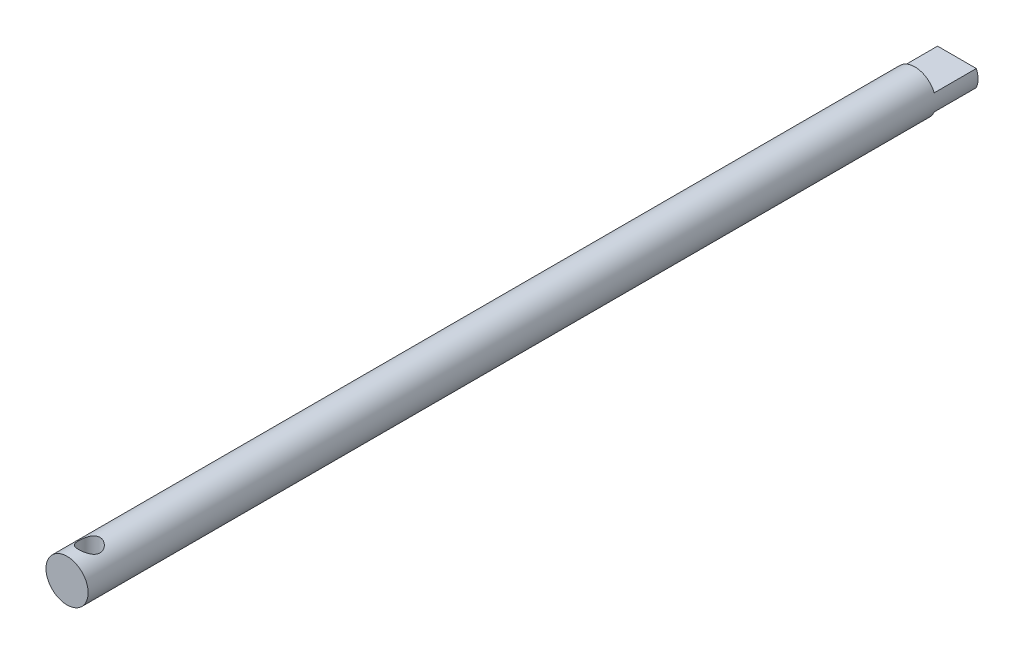
ISO-10303-21;
HEADER;
FILE_DESCRIPTION(('STEP AP214'),'2;1');
FILE_NAME('part.step','',(''),(''),'','','');
FILE_SCHEMA(('AUTOMOTIVE_DESIGN { 1 0 10303 214 1 1 1 1 }'));
ENDSEC;
DATA;
#1=APPLICATION_CONTEXT('core data for automotive mechanical design processes');
#2=APPLICATION_PROTOCOL_DEFINITION('international standard','automotive_design',2000,#1);
#3=PRODUCT_CONTEXT('',#1,'mechanical');
#4=PRODUCT('Part','Part','',(#3));
#5=PRODUCT_RELATED_PRODUCT_CATEGORY('part','',(#4));
#6=PRODUCT_DEFINITION_FORMATION('','',#4);
#7=PRODUCT_DEFINITION_CONTEXT('part definition',#1,'design');
#8=PRODUCT_DEFINITION('design','',#6,#7);
#9=PRODUCT_DEFINITION_SHAPE('','',#8);
#10=(LENGTH_UNIT() NAMED_UNIT(*) SI_UNIT(.MILLI.,.METRE.));
#11=(NAMED_UNIT(*) PLANE_ANGLE_UNIT() SI_UNIT($,.RADIAN.));
#12=(NAMED_UNIT(*) SI_UNIT($,.STERADIAN.) SOLID_ANGLE_UNIT());
#13=UNCERTAINTY_MEASURE_WITH_UNIT(LENGTH_MEASURE(1.E-05),#10,'distance_accuracy_value','');
#14=(GEOMETRIC_REPRESENTATION_CONTEXT(3) GLOBAL_UNCERTAINTY_ASSIGNED_CONTEXT((#13)) GLOBAL_UNIT_ASSIGNED_CONTEXT((#10,
#11,#12)) REPRESENTATION_CONTEXT('',''));
#15=CARTESIAN_POINT('',(0.,0.,0.));
#16=DIRECTION('',(0.,0.,1.));
#17=DIRECTION('',(1.,0.,0.));
#18=AXIS2_PLACEMENT_3D('',#15,#16,#17);
#19=CARTESIAN_POINT('',(0.,0.,134.));
#20=DIRECTION('',(0.,0.,-1.));
#21=DIRECTION('',(-1.,0.,0.));
#22=AXIS2_PLACEMENT_3D('',#19,#20,#21);
#23=CYLINDRICAL_SURFACE('',#22,3.175);
#24=CARTESIAN_POINT('',(0.,-3.175,132.25));
#25=CARTESIAN_POINT('',(0.0840354915149769,-3.17499535783324,132.249994669706));
#26=CARTESIAN_POINT('',(0.168168779521893,-3.17162798348649,132.243340541081));
#27=CARTESIAN_POINT('',(0.333943731430195,-3.15848916648331,132.217020689791));
#28=CARTESIAN_POINT('',(0.415580466872119,-3.14870581713883,132.197330774825));
#29=CARTESIAN_POINT('',(0.573712215402845,-3.12375781958318,132.145907647522));
#30=CARTESIAN_POINT('',(0.650225957772122,-3.10861420825035,132.114221482298));
#31=CARTESIAN_POINT('',(0.796734971886589,-3.07433040312312,132.039951614602));
#32=CARTESIAN_POINT('',(0.866730690542686,-3.05519048362937,131.997368660025));
#33=CARTESIAN_POINT('',(1.0030329519878,-3.0132938289435,131.899554286282));
#34=CARTESIAN_POINT('',(1.0688519169315,-2.99038746996231,131.843708494195));
#35=CARTESIAN_POINT('',(1.19063994181539,-2.94402038200131,131.722278388289));
#36=CARTESIAN_POINT('',(1.2466013680702,-2.92055923920395,131.656686598992));
#37=CARTESIAN_POINT('',(1.35152677202559,-2.87359725077131,131.511407650006));
#38=CARTESIAN_POINT('',(1.39958719874819,-2.85024003635122,131.431015962348));
#39=CARTESIAN_POINT('',(1.48130263507994,-2.8086444606306,131.261992934992));
#40=CARTESIAN_POINT('',(1.51496805169955,-2.79040240457288,131.173367604506));
#41=CARTESIAN_POINT('',(1.56472810353281,-2.76279246709812,130.995830422171));
#42=CARTESIAN_POINT('',(1.58175930807258,-2.75295606862981,130.907257660157));
#43=CARTESIAN_POINT('',(1.60062890319784,-2.74203303451641,130.728011352035));
#44=CARTESIAN_POINT('',(1.60248274144149,-2.7409375023689,130.637340036168));
#45=CARTESIAN_POINT('',(1.5916315421751,-2.74724429166475,130.468364888427));
#46=CARTESIAN_POINT('',(1.58067445141353,-2.75362655636239,130.389901330462));
#47=CARTESIAN_POINT('',(1.54754562929879,-2.77237915662371,130.236126023085));
#48=CARTESIAN_POINT('',(1.52537022945869,-2.78475145092349,130.160815313412));
#49=CARTESIAN_POINT('',(1.47003606631844,-2.81435930685816,130.013331828172));
#50=CARTESIAN_POINT('',(1.4366338675788,-2.83170127706524,129.941272759371));
#51=CARTESIAN_POINT('',(1.35998233689638,-2.86930195073611,129.803433760138));
#52=CARTESIAN_POINT('',(1.31672857860475,-2.88956196378044,129.73765667114));
#53=CARTESIAN_POINT('',(1.21509386917565,-2.93387506692029,129.605310626858));
#54=CARTESIAN_POINT('',(1.15548100893331,-2.95808021315625,129.539735288969));
#55=CARTESIAN_POINT('',(1.02601464463279,-3.00544028389515,129.41909476496));
#56=CARTESIAN_POINT('',(0.956156127156308,-3.02859468694247,129.364034754752));
#57=CARTESIAN_POINT('',(0.803951968011399,-3.07259636724776,129.263506272804));
#58=CARTESIAN_POINT('',(0.721168699942468,-3.09328018134045,129.21862299483));
#59=CARTESIAN_POINT('',(0.547920899458225,-3.12860953391151,129.143790986437));
#60=CARTESIAN_POINT('',(0.457462625481155,-3.14325993622266,129.113830222142));
#61=CARTESIAN_POINT('',(0.279548388931917,-3.16382934030032,129.072188712687));
#62=CARTESIAN_POINT('',(0.192474739042151,-3.17037646386805,129.059187953028));
#63=CARTESIAN_POINT('',(0.0171487539619177,-3.17616259333521,129.047685366001));
#64=CARTESIAN_POINT('',(-0.071102988797268,-3.17540514379075,129.049176506417));
#65=CARTESIAN_POINT('',(-0.238862443066174,-3.1670286531299,129.065863861045));
#66=CARTESIAN_POINT('',(-0.31851012258201,-3.15995644705834,129.079967984215));
#67=CARTESIAN_POINT('',(-0.474144110594144,-3.14037681933826,129.11975795255));
#68=CARTESIAN_POINT('',(-0.550130017262425,-3.12786880268801,129.145445065597));
#69=CARTESIAN_POINT('',(-0.698774171394186,-3.09810446022253,129.208329622684));
#70=CARTESIAN_POINT('',(-0.771277795552405,-3.08072398988326,129.245831701221));
#71=CARTESIAN_POINT('',(-0.909199709151293,-3.04287751276249,129.330935778032));
#72=CARTESIAN_POINT('',(-0.97461498465751,-3.02241020224829,129.378542047307));
#73=CARTESIAN_POINT('',(-1.10339947941932,-2.97795622125718,129.487958450534));
#74=CARTESIAN_POINT('',(-1.16591935656051,-2.95382193757618,129.550709967406));
#75=CARTESIAN_POINT('',(-1.27993115643405,-2.90623909415635,129.685842607323));
#76=CARTESIAN_POINT('',(-1.33141515139893,-2.88279103774907,129.75823059274));
#77=CARTESIAN_POINT('',(-1.42435114695633,-2.83807069855987,129.915186570179));
#78=CARTESIAN_POINT('',(-1.46516499114652,-2.81696816343404,130.000185122928));
#79=CARTESIAN_POINT('',(-1.5314727893315,-2.78148358503796,130.177245467491));
#80=CARTESIAN_POINT('',(-1.55698677998932,-2.76709275764309,130.269297842565));
#81=CARTESIAN_POINT('',(-1.58959332041479,-2.74847942890825,130.448363225511));
#82=CARTESIAN_POINT('',(-1.59822539037284,-2.74340999965212,130.535005841836));
#83=CARTESIAN_POINT('',(-1.60127783888238,-2.74163139318571,130.7086106985));
#84=CARTESIAN_POINT('',(-1.5957047107203,-2.74491839619531,130.795572774667));
#85=CARTESIAN_POINT('',(-1.57194973275586,-2.75857784227936,130.958337315563));
#86=CARTESIAN_POINT('',(-1.55505935669734,-2.76822304925079,131.03439725043));
#87=CARTESIAN_POINT('',(-1.510764123317,-2.79264256567521,131.182514082034));
#88=CARTESIAN_POINT('',(-1.48335583996734,-2.80741854624029,131.254569665659));
#89=CARTESIAN_POINT('',(-1.41675015002022,-2.84164246777159,131.397987910321));
#90=CARTESIAN_POINT('',(-1.37688529746115,-2.86133730315688,131.468979909055));
#91=CARTESIAN_POINT('',(-1.28722599702432,-2.90277676664345,131.603732988555));
#92=CARTESIAN_POINT('',(-1.23742634135303,-2.92452246663622,131.667490249278));
#93=CARTESIAN_POINT('',(-1.12206548730572,-2.97084433449377,131.794198435667));
#94=CARTESIAN_POINT('',(-1.05531509204284,-2.99543675289238,131.856066674724));
#95=CARTESIAN_POINT('',(-0.91171311269748,-3.04222008165362,131.967977706602));
#96=CARTESIAN_POINT('',(-0.834856014481966,-3.06440966891293,132.018014002009));
#97=CARTESIAN_POINT('',(-0.672009756045147,-3.10420898161586,132.104990814961));
#98=CARTESIAN_POINT('',(-0.585945894888746,-3.12177650014219,132.14181169249));
#99=CARTESIAN_POINT('',(-0.407802840894721,-3.14998272237547,132.199974574366));
#100=CARTESIAN_POINT('',(-0.315741446945434,-3.16064098447081,132.221360291475));
#101=CARTESIAN_POINT('',(-0.185594045749869,-3.16978794568765,132.239636300614));
#102=CARTESIAN_POINT('',(-0.148615946688123,-3.17173718875629,132.24351699866));
#103=CARTESIAN_POINT('',(-0.074431632602325,-3.17434426182224,132.248700064346));
#104=CARTESIAN_POINT('',(-0.0372254113414486,-3.17500205635219,132.250002361174));
#105=CARTESIAN_POINT('',(0.,-3.175,132.25));
#106=B_SPLINE_CURVE_WITH_KNOTS('',3,(#24,#25,#26,#27,#28,#29,#30,#31,#32,#33,#34,#35,#36,#37,
#38,#39,#40,#41,#42,#43,#44,#45,#46,#47,#48,#49,#50,#51,#52,#53,#54,#55,#56,#57,#58,#59,#60,#61,
#62,#63,#64,#65,#66,#67,#68,#69,#70,#71,#72,#73,#74,#75,#76,#77,#78,#79,#80,#81,#82,#83,#84,#85,
#86,#87,#88,#89,#90,#91,#92,#93,#94,#95,#96,#97,#98,#99,#100,#101,#102,#103,#104,#105),
.UNSPECIFIED.,.T.,.F.,(4,2,2,2,2,2,2,2,2,2,2,2,2,2,2,2,2,2,2,2,2,2,2,2,2,2,2,2,2,2,2,2,2,2,2,2,
2,2,2,2,4),(0.,0.251955534825393,0.504379973850652,0.755824536273959,1.00725184558625,
1.27405902813782,1.54107192661853,1.82920407616248,2.11712756415384,2.38770073641311,
2.6579984826154,2.89533223516457,3.13274364817971,3.37567629424471,3.61871830708837,
3.89313033479059,4.16767708892701,4.45536408295933,4.74281870208544,5.00621612770787,
5.26948574573086,5.51195547750943,5.75445175661885,6.00379777377191,6.25324939913384,
6.52749050979901,6.80192796972185,7.09022891066143,7.37815146390534,7.6383013545864,
7.89833235042553,8.13283676074473,8.36741762177853,8.61773304932972,8.86818003788736,
9.14971814233347,9.43141049392017,9.71559226486794,9.99896603380201,10.1105723406551,
10.2221817125353),.UNSPECIFIED.);
#107=CARTESIAN_POINT('',(0.,-3.175,132.25));
#108=VERTEX_POINT('',#107);
#109=EDGE_CURVE('E11',#108,#108,#106,.T.);
#110=ORIENTED_EDGE('',*,*,#109,.T.);
#111=EDGE_LOOP('',(#110));
#112=FACE_BOUND('',#111,.T.);
#113=CARTESIAN_POINT('',(0.,3.175,132.25));
#114=CARTESIAN_POINT('',(-0.0840354915149769,3.17499535783324,132.249994669706));
#115=CARTESIAN_POINT('',(-0.168168779521893,3.17162798348649,132.243340541081));
#116=CARTESIAN_POINT('',(-0.333943731430195,3.15848916648331,132.217020689791));
#117=CARTESIAN_POINT('',(-0.415580466872119,3.14870581713883,132.197330774825));
#118=CARTESIAN_POINT('',(-0.573712215402845,3.12375781958318,132.145907647522));
#119=CARTESIAN_POINT('',(-0.650225957772122,3.10861420825035,132.114221482298));
#120=CARTESIAN_POINT('',(-0.796734971886589,3.07433040312312,132.039951614602));
#121=CARTESIAN_POINT('',(-0.866730690542686,3.05519048362937,131.997368660025));
#122=CARTESIAN_POINT('',(-1.0030329519878,3.0132938289435,131.899554286282));
#123=CARTESIAN_POINT('',(-1.0688519169315,2.99038746996231,131.843708494195));
#124=CARTESIAN_POINT('',(-1.19063994181539,2.94402038200131,131.722278388289));
#125=CARTESIAN_POINT('',(-1.2466013680702,2.92055923920395,131.656686598992));
#126=CARTESIAN_POINT('',(-1.35152677202559,2.87359725077131,131.511407650006));
#127=CARTESIAN_POINT('',(-1.39958719874819,2.85024003635122,131.431015962348));
#128=CARTESIAN_POINT('',(-1.48130263507994,2.8086444606306,131.261992934992));
#129=CARTESIAN_POINT('',(-1.51496805169955,2.79040240457288,131.173367604506));
#130=CARTESIAN_POINT('',(-1.56472810353281,2.76279246709812,130.995830422171));
#131=CARTESIAN_POINT('',(-1.58175930807258,2.75295606862981,130.907257660157));
#132=CARTESIAN_POINT('',(-1.60062890319784,2.74203303451641,130.728011352035));
#133=CARTESIAN_POINT('',(-1.60248274144149,2.7409375023689,130.637340036168));
#134=CARTESIAN_POINT('',(-1.5916315421751,2.74724429166475,130.468364888427));
#135=CARTESIAN_POINT('',(-1.58067445141353,2.75362655636239,130.389901330462));
#136=CARTESIAN_POINT('',(-1.54754562929879,2.77237915662371,130.236126023085));
#137=CARTESIAN_POINT('',(-1.52537022945869,2.78475145092349,130.160815313412));
#138=CARTESIAN_POINT('',(-1.47003606631844,2.81435930685816,130.013331828172));
#139=CARTESIAN_POINT('',(-1.4366338675788,2.83170127706524,129.941272759371));
#140=CARTESIAN_POINT('',(-1.35998233689638,2.86930195073611,129.803433760138));
#141=CARTESIAN_POINT('',(-1.31672857860475,2.88956196378044,129.73765667114));
#142=CARTESIAN_POINT('',(-1.21509386917565,2.93387506692029,129.605310626858));
#143=CARTESIAN_POINT('',(-1.15548100893331,2.95808021315625,129.539735288969));
#144=CARTESIAN_POINT('',(-1.02601464463279,3.00544028389515,129.41909476496));
#145=CARTESIAN_POINT('',(-0.956156127156308,3.02859468694247,129.364034754752));
#146=CARTESIAN_POINT('',(-0.803951968011399,3.07259636724776,129.263506272804));
#147=CARTESIAN_POINT('',(-0.721168699942468,3.09328018134045,129.21862299483));
#148=CARTESIAN_POINT('',(-0.547920899458225,3.12860953391151,129.143790986437));
#149=CARTESIAN_POINT('',(-0.457462625481155,3.14325993622266,129.113830222142));
#150=CARTESIAN_POINT('',(-0.279548388931917,3.16382934030032,129.072188712687));
#151=CARTESIAN_POINT('',(-0.192474739042151,3.17037646386805,129.059187953028));
#152=CARTESIAN_POINT('',(-0.0171487539619177,3.17616259333521,129.047685366001));
#153=CARTESIAN_POINT('',(0.071102988797268,3.17540514379075,129.049176506417));
#154=CARTESIAN_POINT('',(0.238862443066174,3.1670286531299,129.065863861045));
#155=CARTESIAN_POINT('',(0.31851012258201,3.15995644705834,129.079967984215));
#156=CARTESIAN_POINT('',(0.474144110594144,3.14037681933826,129.11975795255));
#157=CARTESIAN_POINT('',(0.550130017262425,3.12786880268801,129.145445065597));
#158=CARTESIAN_POINT('',(0.698774171394186,3.09810446022253,129.208329622684));
#159=CARTESIAN_POINT('',(0.771277795552405,3.08072398988326,129.245831701221));
#160=CARTESIAN_POINT('',(0.909199709151293,3.04287751276249,129.330935778032));
#161=CARTESIAN_POINT('',(0.97461498465751,3.02241020224829,129.378542047307));
#162=CARTESIAN_POINT('',(1.10339947941932,2.97795622125718,129.487958450534));
#163=CARTESIAN_POINT('',(1.16591935656051,2.95382193757618,129.550709967406));
#164=CARTESIAN_POINT('',(1.27993115643405,2.90623909415635,129.685842607323));
#165=CARTESIAN_POINT('',(1.33141515139893,2.88279103774907,129.75823059274));
#166=CARTESIAN_POINT('',(1.42435114695633,2.83807069855987,129.915186570179));
#167=CARTESIAN_POINT('',(1.46516499114652,2.81696816343404,130.000185122928));
#168=CARTESIAN_POINT('',(1.5314727893315,2.78148358503796,130.177245467491));
#169=CARTESIAN_POINT('',(1.55698677998932,2.76709275764309,130.269297842565));
#170=CARTESIAN_POINT('',(1.58959332041479,2.74847942890825,130.448363225511));
#171=CARTESIAN_POINT('',(1.59822539037284,2.74340999965212,130.535005841836));
#172=CARTESIAN_POINT('',(1.60127783888238,2.74163139318571,130.7086106985));
#173=CARTESIAN_POINT('',(1.5957047107203,2.74491839619531,130.795572774667));
#174=CARTESIAN_POINT('',(1.57194973275586,2.75857784227936,130.958337315563));
#175=CARTESIAN_POINT('',(1.55505935669734,2.76822304925079,131.03439725043));
#176=CARTESIAN_POINT('',(1.510764123317,2.79264256567521,131.182514082034));
#177=CARTESIAN_POINT('',(1.48335583996734,2.80741854624029,131.254569665659));
#178=CARTESIAN_POINT('',(1.41675015002022,2.84164246777159,131.397987910321));
#179=CARTESIAN_POINT('',(1.37688529746115,2.86133730315688,131.468979909055));
#180=CARTESIAN_POINT('',(1.28722599702432,2.90277676664345,131.603732988555));
#181=CARTESIAN_POINT('',(1.23742634135303,2.92452246663622,131.667490249278));
#182=CARTESIAN_POINT('',(1.12206548730572,2.97084433449377,131.794198435667));
#183=CARTESIAN_POINT('',(1.05531509204284,2.99543675289238,131.856066674724));
#184=CARTESIAN_POINT('',(0.91171311269748,3.04222008165362,131.967977706602));
#185=CARTESIAN_POINT('',(0.834856014481966,3.06440966891293,132.018014002009));
#186=CARTESIAN_POINT('',(0.672009756045147,3.10420898161586,132.104990814961));
#187=CARTESIAN_POINT('',(0.585945894888746,3.12177650014219,132.14181169249));
#188=CARTESIAN_POINT('',(0.407802840894721,3.14998272237547,132.199974574366));
#189=CARTESIAN_POINT('',(0.315741446945434,3.16064098447081,132.221360291475));
#190=CARTESIAN_POINT('',(0.185594045749869,3.16978794568765,132.239636300614));
#191=CARTESIAN_POINT('',(0.148615946688123,3.17173718875629,132.24351699866));
#192=CARTESIAN_POINT('',(0.074431632602325,3.17434426182224,132.248700064346));
#193=CARTESIAN_POINT('',(0.0372254113414486,3.17500205635219,132.250002361174));
#194=CARTESIAN_POINT('',(0.,3.175,132.25));
#195=B_SPLINE_CURVE_WITH_KNOTS('',3,(#113,#114,#115,#116,#117,#118,#119,#120,#121,#122,#123,
#124,#125,#126,#127,#128,#129,#130,#131,#132,#133,#134,#135,#136,#137,#138,#139,#140,#141,#142,
#143,#144,#145,#146,#147,#148,#149,#150,#151,#152,#153,#154,#155,#156,#157,#158,#159,#160,#161,
#162,#163,#164,#165,#166,#167,#168,#169,#170,#171,#172,#173,#174,#175,#176,#177,#178,#179,#180,
#181,#182,#183,#184,#185,#186,#187,#188,#189,#190,#191,#192,#193,#194),.UNSPECIFIED.,.T.,.F.,(4,
2,2,2,2,2,2,2,2,2,2,2,2,2,2,2,2,2,2,2,2,2,2,2,2,2,2,2,2,2,2,2,2,2,2,2,2,2,2,2,4),(0.,
0.251955534825393,0.504379973850652,0.755824536273959,1.00725184558625,1.27405902813782,
1.54107192661853,1.82920407616248,2.11712756415384,2.38770073641311,2.6579984826154,
2.89533223516457,3.13274364817971,3.37567629424471,3.61871830708837,3.89313033479059,
4.16767708892701,4.45536408295933,4.74281870208544,5.00621612770787,5.26948574573086,
5.51195547750943,5.75445175661885,6.00379777377191,6.25324939913384,6.52749050979901,
6.80192796972185,7.09022891066143,7.37815146390534,7.6383013545864,7.89833235042553,
8.13283676074473,8.36741762177853,8.61773304932972,8.86818003788736,9.14971814233347,
9.43141049392017,9.71559226486794,9.99896603380201,10.1105723406551,10.2221817125353),.UNSPECIFIED.);
#196=CARTESIAN_POINT('',(0.,3.175,132.25));
#197=VERTEX_POINT('',#196);
#198=EDGE_CURVE('E51',#197,#197,#195,.T.);
#199=ORIENTED_EDGE('',*,*,#198,.T.);
#200=EDGE_LOOP('',(#199));
#201=FACE_BOUND('',#200,.T.);
#202=CARTESIAN_POINT('',(0.,0.,134.));
#203=DIRECTION('',(0.,0.,1.));
#204=DIRECTION('',(1.,0.,0.));
#205=AXIS2_PLACEMENT_3D('',#202,#203,#204);
#206=CIRCLE('',#205,3.175);
#207=CARTESIAN_POINT('',(3.175,0.,134.));
#208=VERTEX_POINT('',#207);
#209=EDGE_CURVE('E113',#208,#208,#206,.T.);
#210=ORIENTED_EDGE('',*,*,#209,.F.);
#211=EDGE_LOOP('',(#210));
#212=FACE_BOUND('',#211,.T.);
#213=CARTESIAN_POINT('',(0.,0.,6.34));
#214=DIRECTION('',(0.,0.,-1.));
#215=DIRECTION('',(-1.,0.,0.));
#216=AXIS2_PLACEMENT_3D('',#213,#214,#215);
#217=CIRCLE('',#216,3.175);
#218=CARTESIAN_POINT('',(-2.91858270398493,1.25,6.34));
#219=VERTEX_POINT('',#218);
#220=CARTESIAN_POINT('',(2.91858270398493,1.25,6.34));
#221=VERTEX_POINT('',#220);
#222=EDGE_CURVE('E85',#219,#221,#217,.T.);
#223=ORIENTED_EDGE('',*,*,#222,.F.);
#224=DIRECTION('',(0.,0.,-1.));
#225=VECTOR('',#224,1.);
#226=CARTESIAN_POINT('',(-2.91858270398493,1.25,6.34));
#227=LINE('',#226,#225);
#228=CARTESIAN_POINT('',(-2.91858270398493,1.25,0.));
#229=VERTEX_POINT('',#228);
#230=EDGE_CURVE('E93',#219,#229,#227,.T.);
#231=ORIENTED_EDGE('',*,*,#230,.T.);
#232=CARTESIAN_POINT('',(0.,0.,0.));
#233=DIRECTION('',(0.,0.,1.));
#234=DIRECTION('',(1.,0.,0.));
#235=AXIS2_PLACEMENT_3D('',#232,#233,#234);
#236=CIRCLE('',#235,3.175);
#237=CARTESIAN_POINT('',(-2.91858270398493,-1.25,0.));
#238=VERTEX_POINT('',#237);
#239=EDGE_CURVE('E116',#229,#238,#236,.T.);
#240=ORIENTED_EDGE('',*,*,#239,.T.);
#241=DIRECTION('',(0.,0.,-1.));
#242=VECTOR('',#241,1.);
#243=CARTESIAN_POINT('',(-2.91858270398493,-1.25,6.34));
#244=LINE('',#243,#242);
#245=CARTESIAN_POINT('',(-2.91858270398493,-1.25,6.34));
#246=VERTEX_POINT('',#245);
#247=EDGE_CURVE('E58',#246,#238,#244,.T.);
#248=ORIENTED_EDGE('',*,*,#247,.F.);
#249=CARTESIAN_POINT('',(0.,0.,6.34));
#250=DIRECTION('',(0.,0.,-1.));
#251=DIRECTION('',(-1.,0.,0.));
#252=AXIS2_PLACEMENT_3D('',#249,#250,#251);
#253=CIRCLE('',#252,3.175);
#254=CARTESIAN_POINT('',(2.91858270398493,-1.25,6.34));
#255=VERTEX_POINT('',#254);
#256=EDGE_CURVE('E105',#255,#246,#253,.T.);
#257=ORIENTED_EDGE('',*,*,#256,.F.);
#258=DIRECTION('',(0.,0.,-1.));
#259=VECTOR('',#258,1.);
#260=CARTESIAN_POINT('',(2.91858270398493,-1.25,6.34));
#261=LINE('',#260,#259);
#262=CARTESIAN_POINT('',(2.91858270398493,-1.25,0.));
#263=VERTEX_POINT('',#262);
#264=EDGE_CURVE('E109',#255,#263,#261,.T.);
#265=ORIENTED_EDGE('',*,*,#264,.T.);
#266=CARTESIAN_POINT('',(2.91858270398493,1.25,0.));
#267=VERTEX_POINT('',#266);
#268=EDGE_CURVE('E98',#263,#267,#236,.T.);
#269=ORIENTED_EDGE('',*,*,#268,.T.);
#270=DIRECTION('',(0.,0.,-1.));
#271=VECTOR('',#270,1.);
#272=CARTESIAN_POINT('',(2.91858270398493,1.25,6.34));
#273=LINE('',#272,#271);
#274=EDGE_CURVE('E66',#221,#267,#273,.T.);
#275=ORIENTED_EDGE('',*,*,#274,.F.);
#276=EDGE_LOOP('',(#223,#231,#240,#248,#257,#265,#269,#275));
#277=FACE_BOUND('',#276,.T.);
#278=ADVANCED_FACE('F39',(#112,#201,#212,#277),#23,.T.);
#279=CARTESIAN_POINT('',(0.,0.,0.));
#280=DIRECTION('',(0.,0.,1.));
#281=DIRECTION('',(1.,0.,0.));
#282=AXIS2_PLACEMENT_3D('',#279,#280,#281);
#283=PLANE('',#282);
#284=ORIENTED_EDGE('',*,*,#239,.F.);
#285=DIRECTION('',(-1.,0.,0.));
#286=VECTOR('',#285,1.);
#287=CARTESIAN_POINT('',(0.,1.25,0.));
#288=LINE('',#287,#286);
#289=EDGE_CURVE('E90',#267,#229,#288,.T.);
#290=ORIENTED_EDGE('',*,*,#289,.F.);
#291=ORIENTED_EDGE('',*,*,#268,.F.);
#292=DIRECTION('',(-1.,0.,0.));
#293=VECTOR('',#292,1.);
#294=CARTESIAN_POINT('',(0.,-1.25,0.));
#295=LINE('',#294,#293);
#296=EDGE_CURVE('E106',#263,#238,#295,.T.);
#297=ORIENTED_EDGE('',*,*,#296,.T.);
#298=EDGE_LOOP('',(#284,#290,#291,#297));
#299=FACE_BOUND('',#298,.T.);
#300=ADVANCED_FACE('F140',(#299),#283,.F.);
#301=CARTESIAN_POINT('',(0.,0.,134.));
#302=DIRECTION('',(0.,0.,1.));
#303=DIRECTION('',(1.,0.,0.));
#304=AXIS2_PLACEMENT_3D('',#301,#302,#303);
#305=PLANE('',#304);
#306=ORIENTED_EDGE('',*,*,#209,.T.);
#307=EDGE_LOOP('',(#306));
#308=FACE_BOUND('',#307,.T.);
#309=ADVANCED_FACE('F138',(#308),#305,.T.);
#310=CARTESIAN_POINT('',(0.,-1.25,6.34));
#311=DIRECTION('',(0.,-1.,0.));
#312=DIRECTION('',(0.,0.,-1.));
#313=AXIS2_PLACEMENT_3D('',#310,#311,#312);
#314=PLANE('',#313);
#315=ORIENTED_EDGE('',*,*,#296,.F.);
#316=ORIENTED_EDGE('',*,*,#264,.F.);
#317=DIRECTION('',(-1.,0.,0.));
#318=VECTOR('',#317,1.);
#319=CARTESIAN_POINT('',(0.,-1.25,6.34));
#320=LINE('',#319,#318);
#321=EDGE_CURVE('E103',#255,#246,#320,.T.);
#322=ORIENTED_EDGE('',*,*,#321,.T.);
#323=ORIENTED_EDGE('',*,*,#247,.T.);
#324=EDGE_LOOP('',(#315,#316,#322,#323));
#325=FACE_BOUND('',#324,.T.);
#326=ADVANCED_FACE('F134',(#325),#314,.T.);
#327=CARTESIAN_POINT('',(0.,0.,6.34));
#328=DIRECTION('',(0.,0.,-1.));
#329=DIRECTION('',(-1.,0.,0.));
#330=AXIS2_PLACEMENT_3D('',#327,#328,#329);
#331=PLANE('',#330);
#332=ORIENTED_EDGE('',*,*,#321,.F.);
#333=ORIENTED_EDGE('',*,*,#256,.T.);
#334=EDGE_LOOP('',(#332,#333));
#335=FACE_BOUND('',#334,.T.);
#336=ADVANCED_FACE('F131',(#335),#331,.T.);
#337=CARTESIAN_POINT('',(0.,1.25,6.34));
#338=DIRECTION('',(0.,-1.,0.));
#339=DIRECTION('',(1.,0.,0.));
#340=AXIS2_PLACEMENT_3D('',#337,#338,#339);
#341=PLANE('',#340);
#342=ORIENTED_EDGE('',*,*,#289,.T.);
#343=ORIENTED_EDGE('',*,*,#230,.F.);
#344=DIRECTION('',(-1.,0.,0.));
#345=VECTOR('',#344,1.);
#346=CARTESIAN_POINT('',(0.,1.25,6.34));
#347=LINE('',#346,#345);
#348=EDGE_CURVE('E87',#221,#219,#347,.T.);
#349=ORIENTED_EDGE('',*,*,#348,.F.);
#350=ORIENTED_EDGE('',*,*,#274,.T.);
#351=EDGE_LOOP('',(#342,#343,#349,#350));
#352=FACE_BOUND('',#351,.T.);
#353=ADVANCED_FACE('F92',(#352),#341,.F.);
#354=CARTESIAN_POINT('',(0.,0.,6.34));
#355=DIRECTION('',(0.,0.,-1.));
#356=DIRECTION('',(-1.,0.,0.));
#357=AXIS2_PLACEMENT_3D('',#354,#355,#356);
#358=PLANE('',#357);
#359=ORIENTED_EDGE('',*,*,#222,.T.);
#360=ORIENTED_EDGE('',*,*,#348,.T.);
#361=EDGE_LOOP('',(#359,#360));
#362=FACE_BOUND('',#361,.T.);
#363=ADVANCED_FACE('F86',(#362),#358,.T.);
#364=CARTESIAN_POINT('',(0.,-3.175,130.65));
#365=DIRECTION('',(0.,1.,0.));
#366=DIRECTION('',(0.,0.,1.));
#367=AXIS2_PLACEMENT_3D('',#364,#365,#366);
#368=CYLINDRICAL_SURFACE('',#367,1.59999999999999);
#369=ORIENTED_EDGE('',*,*,#198,.F.);
#370=EDGE_LOOP('',(#369));
#371=FACE_BOUND('',#370,.T.);
#372=ORIENTED_EDGE('',*,*,#109,.F.);
#373=EDGE_LOOP('',(#372));
#374=FACE_BOUND('',#373,.T.);
#375=ADVANCED_FACE('F121',(#371,#374),#368,.F.);
#376=CLOSED_SHELL('',(#278,#300,#309,#326,#336,#353,#363,#375));
#377=MANIFOLD_SOLID_BREP('B2',#376);
#378=ADVANCED_BREP_SHAPE_REPRESENTATION('',(#18,#377),#14);
#379=SHAPE_DEFINITION_REPRESENTATION(#9,#378);
ENDSEC;
END-ISO-10303-21;
